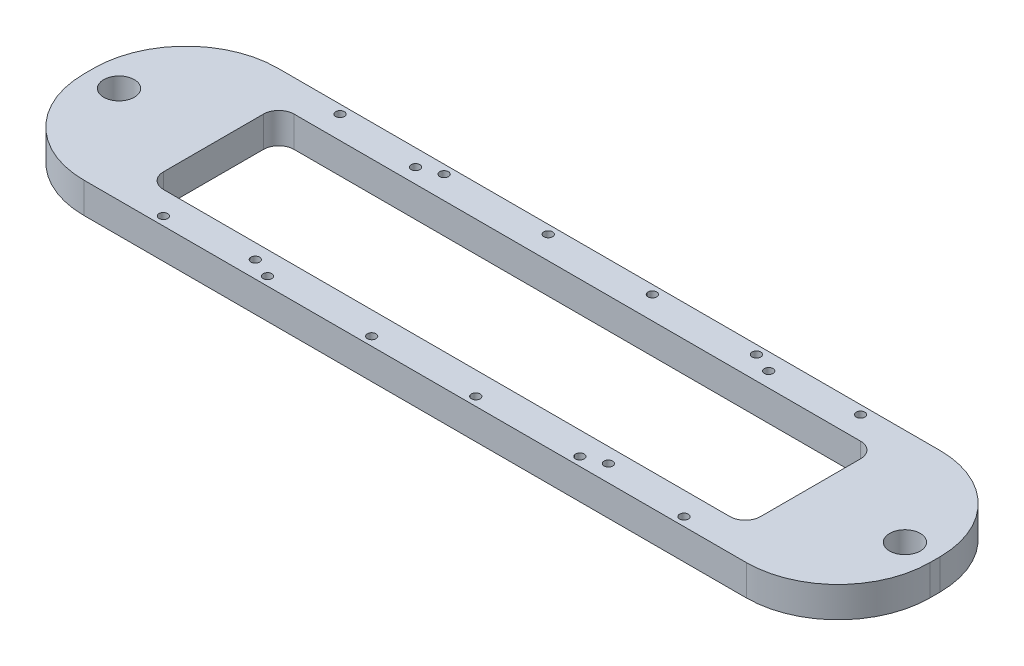
ISO-10303-21;
HEADER;
FILE_DESCRIPTION(('STEP AP214'),'2;1');
FILE_NAME('part.step','',(''),(''),'','','');
FILE_SCHEMA(('AUTOMOTIVE_DESIGN { 1 0 10303 214 1 1 1 1 }'));
ENDSEC;
DATA;
#1=APPLICATION_CONTEXT('core data for automotive mechanical design processes');
#2=APPLICATION_PROTOCOL_DEFINITION('international standard','automotive_design',2000,#1);
#3=PRODUCT_CONTEXT('',#1,'mechanical');
#4=PRODUCT('Part','Part','',(#3));
#5=PRODUCT_RELATED_PRODUCT_CATEGORY('part','',(#4));
#6=PRODUCT_DEFINITION_FORMATION('','',#4);
#7=PRODUCT_DEFINITION_CONTEXT('part definition',#1,'design');
#8=PRODUCT_DEFINITION('design','',#6,#7);
#9=PRODUCT_DEFINITION_SHAPE('','',#8);
#10=(LENGTH_UNIT() NAMED_UNIT(*) SI_UNIT(.MILLI.,.METRE.));
#11=(NAMED_UNIT(*) PLANE_ANGLE_UNIT() SI_UNIT($,.RADIAN.));
#12=(NAMED_UNIT(*) SI_UNIT($,.STERADIAN.) SOLID_ANGLE_UNIT());
#13=UNCERTAINTY_MEASURE_WITH_UNIT(LENGTH_MEASURE(1.E-05),#10,'distance_accuracy_value','');
#14=(GEOMETRIC_REPRESENTATION_CONTEXT(3) GLOBAL_UNCERTAINTY_ASSIGNED_CONTEXT((#13)) GLOBAL_UNIT_ASSIGNED_CONTEXT((#10,
#11,#12)) REPRESENTATION_CONTEXT('',''));
#15=CARTESIAN_POINT('',(0.,0.,0.));
#16=DIRECTION('',(0.,0.,1.));
#17=DIRECTION('',(1.,0.,0.));
#18=AXIS2_PLACEMENT_3D('',#15,#16,#17);
#19=CARTESIAN_POINT('',(57.95,3.,0.499999999999995));
#20=DIRECTION('',(0.,1.,0.));
#21=DIRECTION('',(0.,0.,1.));
#22=AXIS2_PLACEMENT_3D('',#19,#20,#21);
#23=PLANE('',#22);
#24=CARTESIAN_POINT('',(42.8,3.,7.85));
#25=DIRECTION('',(0.,1.,0.));
#26=DIRECTION('',(0.,0.,1.));
#27=AXIS2_PLACEMENT_3D('',#24,#25,#26);
#28=CIRCLE('',#27,0.425000000000003);
#29=CARTESIAN_POINT('',(42.8,3.,8.275));
#30=VERTEX_POINT('',#29);
#31=EDGE_CURVE('E464',#30,#30,#28,.T.);
#32=ORIENTED_EDGE('',*,*,#31,.F.);
#33=EDGE_LOOP('',(#32));
#34=FACE_BOUND('',#33,.T.);
#35=CARTESIAN_POINT('',(8.2,3.,-7.85));
#36=DIRECTION('',(0.,1.,0.));
#37=DIRECTION('',(0.,0.,1.));
#38=AXIS2_PLACEMENT_3D('',#35,#36,#37);
#39=CIRCLE('',#38,0.425);
#40=CARTESIAN_POINT('',(8.2,3.,-7.425));
#41=VERTEX_POINT('',#40);
#42=EDGE_CURVE('E476',#41,#41,#39,.T.);
#43=ORIENTED_EDGE('',*,*,#42,.F.);
#44=EDGE_LOOP('',(#43));
#45=FACE_BOUND('',#44,.T.);
#46=CARTESIAN_POINT('',(40.8,3.,8.65));
#47=DIRECTION('',(0.,1.,0.));
#48=DIRECTION('',(0.,0.,1.));
#49=AXIS2_PLACEMENT_3D('',#46,#47,#48);
#50=CIRCLE('',#49,0.425000000000003);
#51=CARTESIAN_POINT('',(40.8,3.,9.075));
#52=VERTEX_POINT('',#51);
#53=EDGE_CURVE('E488',#52,#52,#50,.T.);
#54=ORIENTED_EDGE('',*,*,#53,.F.);
#55=EDGE_LOOP('',(#54));
#56=FACE_BOUND('',#55,.T.);
#57=CARTESIAN_POINT('',(20.4,3.,8.65));
#58=DIRECTION('',(0.,1.,0.));
#59=DIRECTION('',(0.,0.,1.));
#60=AXIS2_PLACEMENT_3D('',#57,#58,#59);
#61=CIRCLE('',#60,0.425);
#62=CARTESIAN_POINT('',(20.4,3.,9.075));
#63=VERTEX_POINT('',#62);
#64=EDGE_CURVE('E500',#63,#63,#61,.T.);
#65=ORIENTED_EDGE('',*,*,#64,.F.);
#66=EDGE_LOOP('',(#65));
#67=FACE_BOUND('',#66,.T.);
#68=CARTESIAN_POINT('',(0.,3.,8.65));
#69=DIRECTION('',(0.,1.,0.));
#70=DIRECTION('',(0.,0.,1.));
#71=AXIS2_PLACEMENT_3D('',#68,#69,#70);
#72=CIRCLE('',#71,0.424999999999999);
#73=CARTESIAN_POINT('',(0.,3.,9.075));
#74=VERTEX_POINT('',#73);
#75=EDGE_CURVE('E512',#74,#74,#72,.T.);
#76=ORIENTED_EDGE('',*,*,#75,.F.);
#77=EDGE_LOOP('',(#76));
#78=FACE_BOUND('',#77,.T.);
#79=CARTESIAN_POINT('',(10.2,3.,-8.65));
#80=DIRECTION('',(0.,1.,0.));
#81=DIRECTION('',(0.,0.,1.));
#82=AXIS2_PLACEMENT_3D('',#79,#80,#81);
#83=CIRCLE('',#82,0.425);
#84=CARTESIAN_POINT('',(10.2,3.,-8.225));
#85=VERTEX_POINT('',#84);
#86=EDGE_CURVE('E524',#85,#85,#83,.T.);
#87=ORIENTED_EDGE('',*,*,#86,.F.);
#88=EDGE_LOOP('',(#87));
#89=FACE_BOUND('',#88,.T.);
#90=CARTESIAN_POINT('',(30.6,3.,-8.65));
#91=DIRECTION('',(0.,1.,0.));
#92=DIRECTION('',(0.,0.,1.));
#93=AXIS2_PLACEMENT_3D('',#90,#91,#92);
#94=CIRCLE('',#93,0.425);
#95=CARTESIAN_POINT('',(30.6,3.,-8.225));
#96=VERTEX_POINT('',#95);
#97=EDGE_CURVE('E536',#96,#96,#94,.T.);
#98=ORIENTED_EDGE('',*,*,#97,.F.);
#99=EDGE_LOOP('',(#98));
#100=FACE_BOUND('',#99,.T.);
#101=CARTESIAN_POINT('',(51.,3.,-8.65));
#102=DIRECTION('',(0.,1.,0.));
#103=DIRECTION('',(0.,0.,1.));
#104=AXIS2_PLACEMENT_3D('',#101,#102,#103);
#105=CIRCLE('',#104,0.425000000000003);
#106=CARTESIAN_POINT('',(51.,3.,-8.225));
#107=VERTEX_POINT('',#106);
#108=EDGE_CURVE('E184',#107,#107,#105,.T.);
#109=ORIENTED_EDGE('',*,*,#108,.F.);
#110=EDGE_LOOP('',(#109));
#111=FACE_BOUND('',#110,.T.);
#112=CARTESIAN_POINT('',(64.,3.,0.));
#113=DIRECTION('',(0.,1.,0.));
#114=DIRECTION('',(0.,0.,1.));
#115=AXIS2_PLACEMENT_3D('',#112,#113,#114);
#116=CIRCLE('',#115,1.5);
#117=CARTESIAN_POINT('',(64.,3.,1.5));
#118=VERTEX_POINT('',#117);
#119=EDGE_CURVE('E220',#118,#118,#116,.T.);
#120=ORIENTED_EDGE('',*,*,#119,.F.);
#121=EDGE_LOOP('',(#120));
#122=FACE_BOUND('',#121,.T.);
#123=CARTESIAN_POINT('',(57.95,3.,0.499999999999995));
#124=DIRECTION('',(0.,1.,0.));
#125=DIRECTION('',(0.,0.,1.));
#126=AXIS2_PLACEMENT_3D('',#123,#124,#125);
#127=CIRCLE('',#126,9.);
#128=CARTESIAN_POINT('',(57.9499999999999,3.,9.5));
#129=VERTEX_POINT('',#128);
#130=CARTESIAN_POINT('',(66.95,3.,0.499999999999934));
#131=VERTEX_POINT('',#130);
#132=EDGE_CURVE('E226',#129,#131,#127,.T.);
#133=ORIENTED_EDGE('',*,*,#132,.T.);
#134=DIRECTION('',(0.,0.,-1.));
#135=VECTOR('',#134,1.);
#136=CARTESIAN_POINT('',(66.95,3.,-0.499999999999941));
#137=LINE('',#136,#135);
#138=CARTESIAN_POINT('',(66.95,3.,-0.499999999999941));
#139=VERTEX_POINT('',#138);
#140=EDGE_CURVE('E229',#131,#139,#137,.T.);
#141=ORIENTED_EDGE('',*,*,#140,.T.);
#142=CARTESIAN_POINT('',(57.95,3.,-0.500000000000004));
#143=DIRECTION('',(0.,1.,0.));
#144=DIRECTION('',(0.,0.,1.));
#145=AXIS2_PLACEMENT_3D('',#142,#143,#144);
#146=CIRCLE('',#145,9.);
#147=CARTESIAN_POINT('',(57.9499999999999,3.,-9.5));
#148=VERTEX_POINT('',#147);
#149=EDGE_CURVE('E232',#139,#148,#146,.T.);
#150=ORIENTED_EDGE('',*,*,#149,.T.);
#151=DIRECTION('',(-1.,0.,0.));
#152=VECTOR('',#151,1.);
#153=CARTESIAN_POINT('',(57.9499999999999,3.,-9.5));
#154=LINE('',#153,#152);
#155=CARTESIAN_POINT('',(-6.94999999999994,3.,-9.5));
#156=VERTEX_POINT('',#155);
#157=EDGE_CURVE('E234',#148,#156,#154,.T.);
#158=ORIENTED_EDGE('',*,*,#157,.T.);
#159=CARTESIAN_POINT('',(-6.95,3.,-0.499999999999999));
#160=DIRECTION('',(0.,1.,0.));
#161=DIRECTION('',(0.,0.,1.));
#162=AXIS2_PLACEMENT_3D('',#159,#160,#161);
#163=CIRCLE('',#162,9.);
#164=CARTESIAN_POINT('',(-15.95,3.,-0.499999999999932));
#165=VERTEX_POINT('',#164);
#166=EDGE_CURVE('E236',#156,#165,#163,.T.);
#167=ORIENTED_EDGE('',*,*,#166,.T.);
#168=DIRECTION('',(0.,0.,1.));
#169=VECTOR('',#168,1.);
#170=CARTESIAN_POINT('',(-15.95,3.,-0.499999999999932));
#171=LINE('',#170,#169);
#172=CARTESIAN_POINT('',(-15.95,3.,0.500000000000001));
#173=VERTEX_POINT('',#172);
#174=EDGE_CURVE('E238',#165,#173,#171,.T.);
#175=ORIENTED_EDGE('',*,*,#174,.T.);
#176=CARTESIAN_POINT('',(-6.95,3.,0.500000000000002));
#177=DIRECTION('',(0.,1.,0.));
#178=DIRECTION('',(0.,0.,1.));
#179=AXIS2_PLACEMENT_3D('',#176,#177,#178);
#180=CIRCLE('',#179,9.);
#181=CARTESIAN_POINT('',(-6.94999999999994,3.,9.5));
#182=VERTEX_POINT('',#181);
#183=EDGE_CURVE('E240',#173,#182,#180,.T.);
#184=ORIENTED_EDGE('',*,*,#183,.T.);
#185=DIRECTION('',(1.,0.,0.));
#186=VECTOR('',#185,1.);
#187=CARTESIAN_POINT('',(57.9499999999999,3.,9.5));
#188=LINE('',#187,#186);
#189=EDGE_CURVE('E242',#182,#129,#188,.T.);
#190=ORIENTED_EDGE('',*,*,#189,.T.);
#191=EDGE_LOOP('',(#133,#141,#150,#158,#167,#175,#184,#190));
#192=FACE_BOUND('',#191,.T.);
#193=CARTESIAN_POINT('',(-13.,3.,0.));
#194=DIRECTION('',(0.,1.,0.));
#195=DIRECTION('',(0.,0.,1.));
#196=AXIS2_PLACEMENT_3D('',#193,#194,#195);
#197=CIRCLE('',#196,1.5);
#198=CARTESIAN_POINT('',(-13.,3.,1.5));
#199=VERTEX_POINT('',#198);
#200=EDGE_CURVE('E214',#199,#199,#197,.T.);
#201=ORIENTED_EDGE('',*,*,#200,.F.);
#202=EDGE_LOOP('',(#201));
#203=FACE_BOUND('',#202,.T.);
#204=DIRECTION('',(-1.,0.,0.));
#205=VECTOR('',#204,1.);
#206=CARTESIAN_POINT('',(-2.24999999999999,3.,-6.4));
#207=LINE('',#206,#205);
#208=CARTESIAN_POINT('',(53.25,3.,-6.4));
#209=VERTEX_POINT('',#208);
#210=CARTESIAN_POINT('',(-2.24999999999999,3.,-6.4));
#211=VERTEX_POINT('',#210);
#212=EDGE_CURVE('E154',#209,#211,#207,.T.);
#213=ORIENTED_EDGE('',*,*,#212,.F.);
#214=CARTESIAN_POINT('',(53.25,3.,-4.9));
#215=DIRECTION('',(0.,1.,0.));
#216=DIRECTION('',(0.,0.,1.));
#217=AXIS2_PLACEMENT_3D('',#214,#215,#216);
#218=CIRCLE('',#217,1.5);
#219=CARTESIAN_POINT('',(54.75,3.,-4.89999999999999));
#220=VERTEX_POINT('',#219);
#221=EDGE_CURVE('E146',#220,#209,#218,.T.);
#222=ORIENTED_EDGE('',*,*,#221,.F.);
#223=DIRECTION('',(0.,0.,-1.));
#224=VECTOR('',#223,1.);
#225=CARTESIAN_POINT('',(54.75,3.,-4.89999999999999));
#226=LINE('',#225,#224);
#227=CARTESIAN_POINT('',(54.75,3.,4.9));
#228=VERTEX_POINT('',#227);
#229=EDGE_CURVE('E181',#228,#220,#226,.T.);
#230=ORIENTED_EDGE('',*,*,#229,.F.);
#231=CARTESIAN_POINT('',(53.25,3.,4.9));
#232=DIRECTION('',(0.,1.,0.));
#233=DIRECTION('',(0.,0.,1.));
#234=AXIS2_PLACEMENT_3D('',#231,#232,#233);
#235=CIRCLE('',#234,1.5);
#236=CARTESIAN_POINT('',(53.25,3.,6.4));
#237=VERTEX_POINT('',#236);
#238=EDGE_CURVE('E179',#237,#228,#235,.T.);
#239=ORIENTED_EDGE('',*,*,#238,.F.);
#240=DIRECTION('',(1.,0.,0.));
#241=VECTOR('',#240,1.);
#242=CARTESIAN_POINT('',(-2.24999999999999,3.,6.4));
#243=LINE('',#242,#241);
#244=CARTESIAN_POINT('',(-2.24999999999999,3.,6.4));
#245=VERTEX_POINT('',#244);
#246=EDGE_CURVE('E177',#245,#237,#243,.T.);
#247=ORIENTED_EDGE('',*,*,#246,.F.);
#248=CARTESIAN_POINT('',(-2.25,3.,4.9));
#249=DIRECTION('',(0.,1.,0.));
#250=DIRECTION('',(0.,0.,1.));
#251=AXIS2_PLACEMENT_3D('',#248,#249,#250);
#252=CIRCLE('',#251,1.5);
#253=CARTESIAN_POINT('',(-3.75,3.,4.89999999999999));
#254=VERTEX_POINT('',#253);
#255=EDGE_CURVE('E175',#254,#245,#252,.T.);
#256=ORIENTED_EDGE('',*,*,#255,.F.);
#257=DIRECTION('',(0.,0.,1.));
#258=VECTOR('',#257,1.);
#259=CARTESIAN_POINT('',(-3.75,3.,-4.89999999999999));
#260=LINE('',#259,#258);
#261=CARTESIAN_POINT('',(-3.75,3.,-4.89999999999999));
#262=VERTEX_POINT('',#261);
#263=EDGE_CURVE('E170',#262,#254,#260,.T.);
#264=ORIENTED_EDGE('',*,*,#263,.F.);
#265=CARTESIAN_POINT('',(-2.25,3.,-4.9));
#266=DIRECTION('',(0.,1.,0.));
#267=DIRECTION('',(0.,0.,1.));
#268=AXIS2_PLACEMENT_3D('',#265,#266,#267);
#269=CIRCLE('',#268,1.5);
#270=EDGE_CURVE('E168',#211,#262,#269,.T.);
#271=ORIENTED_EDGE('',*,*,#270,.F.);
#272=EDGE_LOOP('',(#213,#222,#230,#239,#247,#256,#264,#271));
#273=FACE_BOUND('',#272,.T.);
#274=CARTESIAN_POINT('',(40.8,3.,-8.65));
#275=DIRECTION('',(0.,1.,0.));
#276=DIRECTION('',(0.,0.,1.));
#277=AXIS2_PLACEMENT_3D('',#274,#275,#276);
#278=CIRCLE('',#277,0.425000000000003);
#279=CARTESIAN_POINT('',(40.8,3.,-8.225));
#280=VERTEX_POINT('',#279);
#281=EDGE_CURVE('E542',#280,#280,#278,.T.);
#282=ORIENTED_EDGE('',*,*,#281,.F.);
#283=EDGE_LOOP('',(#282));
#284=FACE_BOUND('',#283,.T.);
#285=CARTESIAN_POINT('',(20.4,3.,-8.65));
#286=DIRECTION('',(0.,1.,0.));
#287=DIRECTION('',(0.,0.,1.));
#288=AXIS2_PLACEMENT_3D('',#285,#286,#287);
#289=CIRCLE('',#288,0.425);
#290=CARTESIAN_POINT('',(20.4,3.,-8.225));
#291=VERTEX_POINT('',#290);
#292=EDGE_CURVE('E530',#291,#291,#289,.T.);
#293=ORIENTED_EDGE('',*,*,#292,.F.);
#294=EDGE_LOOP('',(#293));
#295=FACE_BOUND('',#294,.T.);
#296=CARTESIAN_POINT('',(0.,3.,-8.65));
#297=DIRECTION('',(0.,1.,0.));
#298=DIRECTION('',(0.,0.,1.));
#299=AXIS2_PLACEMENT_3D('',#296,#297,#298);
#300=CIRCLE('',#299,0.425);
#301=CARTESIAN_POINT('',(0.,3.,-8.225));
#302=VERTEX_POINT('',#301);
#303=EDGE_CURVE('E518',#302,#302,#300,.T.);
#304=ORIENTED_EDGE('',*,*,#303,.F.);
#305=EDGE_LOOP('',(#304));
#306=FACE_BOUND('',#305,.T.);
#307=CARTESIAN_POINT('',(10.2,3.,8.65));
#308=DIRECTION('',(0.,1.,0.));
#309=DIRECTION('',(0.,0.,1.));
#310=AXIS2_PLACEMENT_3D('',#307,#308,#309);
#311=CIRCLE('',#310,0.424999999999998);
#312=CARTESIAN_POINT('',(10.2,3.,9.075));
#313=VERTEX_POINT('',#312);
#314=EDGE_CURVE('E506',#313,#313,#311,.T.);
#315=ORIENTED_EDGE('',*,*,#314,.F.);
#316=EDGE_LOOP('',(#315));
#317=FACE_BOUND('',#316,.T.);
#318=CARTESIAN_POINT('',(30.6,3.,8.65));
#319=DIRECTION('',(0.,1.,0.));
#320=DIRECTION('',(0.,0.,1.));
#321=AXIS2_PLACEMENT_3D('',#318,#319,#320);
#322=CIRCLE('',#321,0.425);
#323=CARTESIAN_POINT('',(30.6,3.,9.075));
#324=VERTEX_POINT('',#323);
#325=EDGE_CURVE('E494',#324,#324,#322,.T.);
#326=ORIENTED_EDGE('',*,*,#325,.F.);
#327=EDGE_LOOP('',(#326));
#328=FACE_BOUND('',#327,.T.);
#329=CARTESIAN_POINT('',(51.,3.,8.65));
#330=DIRECTION('',(0.,1.,0.));
#331=DIRECTION('',(0.,0.,1.));
#332=AXIS2_PLACEMENT_3D('',#329,#330,#331);
#333=CIRCLE('',#332,0.425000000000003);
#334=CARTESIAN_POINT('',(51.,3.,9.075));
#335=VERTEX_POINT('',#334);
#336=EDGE_CURVE('E482',#335,#335,#333,.T.);
#337=ORIENTED_EDGE('',*,*,#336,.F.);
#338=EDGE_LOOP('',(#337));
#339=FACE_BOUND('',#338,.T.);
#340=CARTESIAN_POINT('',(42.8,3.,-7.85));
#341=DIRECTION('',(0.,1.,0.));
#342=DIRECTION('',(0.,0.,1.));
#343=AXIS2_PLACEMENT_3D('',#340,#341,#342);
#344=CIRCLE('',#343,0.425000000000003);
#345=CARTESIAN_POINT('',(42.8,3.,-7.425));
#346=VERTEX_POINT('',#345);
#347=EDGE_CURVE('E470',#346,#346,#344,.T.);
#348=ORIENTED_EDGE('',*,*,#347,.F.);
#349=EDGE_LOOP('',(#348));
#350=FACE_BOUND('',#349,.T.);
#351=CARTESIAN_POINT('',(8.20000000000001,3.,7.85));
#352=DIRECTION('',(0.,1.,0.));
#353=DIRECTION('',(0.,0.,1.));
#354=AXIS2_PLACEMENT_3D('',#351,#352,#353);
#355=CIRCLE('',#354,0.425);
#356=CARTESIAN_POINT('',(8.20000000000001,3.,8.275));
#357=VERTEX_POINT('',#356);
#358=EDGE_CURVE('E455',#357,#357,#355,.T.);
#359=ORIENTED_EDGE('',*,*,#358,.F.);
#360=EDGE_LOOP('',(#359));
#361=FACE_BOUND('',#360,.T.);
#362=ADVANCED_FACE('F33',(#34,#45,#56,#67,#78,#89,#100,#111,#122,#192,#203,#273,#284,#295,#306,
#317,#328,#339,#350,#361),#23,.T.);
#363=CARTESIAN_POINT('',(57.95,0.,0.499999999999995));
#364=DIRECTION('',(0.,1.,0.));
#365=DIRECTION('',(0.,0.,1.));
#366=AXIS2_PLACEMENT_3D('',#363,#364,#365);
#367=PLANE('',#366);
#368=CARTESIAN_POINT('',(-13.,0.,0.));
#369=DIRECTION('',(0.,1.,0.));
#370=DIRECTION('',(0.,0.,1.));
#371=AXIS2_PLACEMENT_3D('',#368,#369,#370);
#372=CIRCLE('',#371,1.5);
#373=CARTESIAN_POINT('',(-13.,0.,1.5));
#374=VERTEX_POINT('',#373);
#375=EDGE_CURVE('E162',#374,#374,#372,.T.);
#376=ORIENTED_EDGE('',*,*,#375,.T.);
#377=EDGE_LOOP('',(#376));
#378=FACE_BOUND('',#377,.T.);
#379=CARTESIAN_POINT('',(64.,0.,0.));
#380=DIRECTION('',(0.,1.,0.));
#381=DIRECTION('',(0.,0.,1.));
#382=AXIS2_PLACEMENT_3D('',#379,#380,#381);
#383=CIRCLE('',#382,1.5);
#384=CARTESIAN_POINT('',(64.,0.,1.5));
#385=VERTEX_POINT('',#384);
#386=EDGE_CURVE('E217',#385,#385,#383,.T.);
#387=ORIENTED_EDGE('',*,*,#386,.T.);
#388=EDGE_LOOP('',(#387));
#389=FACE_BOUND('',#388,.T.);
#390=CARTESIAN_POINT('',(57.95,0.,0.499999999999995));
#391=DIRECTION('',(0.,1.,0.));
#392=DIRECTION('',(0.,0.,1.));
#393=AXIS2_PLACEMENT_3D('',#390,#391,#392);
#394=CIRCLE('',#393,9.);
#395=CARTESIAN_POINT('',(57.9499999999999,0.,9.5));
#396=VERTEX_POINT('',#395);
#397=CARTESIAN_POINT('',(66.95,0.,0.499999999999934));
#398=VERTEX_POINT('',#397);
#399=EDGE_CURVE('E223',#396,#398,#394,.T.);
#400=ORIENTED_EDGE('',*,*,#399,.F.);
#401=DIRECTION('',(1.,0.,0.));
#402=VECTOR('',#401,1.);
#403=CARTESIAN_POINT('',(57.9499999999999,0.,9.5));
#404=LINE('',#403,#402);
#405=CARTESIAN_POINT('',(-6.94999999999994,0.,9.5));
#406=VERTEX_POINT('',#405);
#407=EDGE_CURVE('E230',#406,#396,#404,.T.);
#408=ORIENTED_EDGE('',*,*,#407,.F.);
#409=CARTESIAN_POINT('',(-6.95,0.,0.500000000000002));
#410=DIRECTION('',(0.,1.,0.));
#411=DIRECTION('',(0.,0.,1.));
#412=AXIS2_PLACEMENT_3D('',#409,#410,#411);
#413=CIRCLE('',#412,9.);
#414=CARTESIAN_POINT('',(-15.95,0.,0.500000000000001));
#415=VERTEX_POINT('',#414);
#416=EDGE_CURVE('E257',#415,#406,#413,.T.);
#417=ORIENTED_EDGE('',*,*,#416,.F.);
#418=DIRECTION('',(0.,0.,1.));
#419=VECTOR('',#418,1.);
#420=CARTESIAN_POINT('',(-15.95,0.,-0.499999999999932));
#421=LINE('',#420,#419);
#422=CARTESIAN_POINT('',(-15.95,0.,-0.499999999999932));
#423=VERTEX_POINT('',#422);
#424=EDGE_CURVE('E255',#423,#415,#421,.T.);
#425=ORIENTED_EDGE('',*,*,#424,.F.);
#426=CARTESIAN_POINT('',(-6.95,0.,-0.499999999999999));
#427=DIRECTION('',(0.,1.,0.));
#428=DIRECTION('',(0.,0.,1.));
#429=AXIS2_PLACEMENT_3D('',#426,#427,#428);
#430=CIRCLE('',#429,9.);
#431=CARTESIAN_POINT('',(-6.94999999999994,0.,-9.5));
#432=VERTEX_POINT('',#431);
#433=EDGE_CURVE('E253',#432,#423,#430,.T.);
#434=ORIENTED_EDGE('',*,*,#433,.F.);
#435=DIRECTION('',(-1.,0.,0.));
#436=VECTOR('',#435,1.);
#437=CARTESIAN_POINT('',(57.9499999999999,0.,-9.5));
#438=LINE('',#437,#436);
#439=CARTESIAN_POINT('',(57.9499999999999,0.,-9.5));
#440=VERTEX_POINT('',#439);
#441=EDGE_CURVE('E251',#440,#432,#438,.T.);
#442=ORIENTED_EDGE('',*,*,#441,.F.);
#443=CARTESIAN_POINT('',(57.95,0.,-0.500000000000004));
#444=DIRECTION('',(0.,1.,0.));
#445=DIRECTION('',(0.,0.,1.));
#446=AXIS2_PLACEMENT_3D('',#443,#444,#445);
#447=CIRCLE('',#446,9.);
#448=CARTESIAN_POINT('',(66.95,0.,-0.499999999999941));
#449=VERTEX_POINT('',#448);
#450=EDGE_CURVE('E249',#449,#440,#447,.T.);
#451=ORIENTED_EDGE('',*,*,#450,.F.);
#452=DIRECTION('',(0.,0.,-1.));
#453=VECTOR('',#452,1.);
#454=CARTESIAN_POINT('',(66.95,0.,-0.499999999999941));
#455=LINE('',#454,#453);
#456=EDGE_CURVE('E247',#398,#449,#455,.T.);
#457=ORIENTED_EDGE('',*,*,#456,.F.);
#458=EDGE_LOOP('',(#400,#408,#417,#425,#434,#442,#451,#457));
#459=FACE_BOUND('',#458,.T.);
#460=CARTESIAN_POINT('',(53.25,0.,-4.9));
#461=DIRECTION('',(0.,1.,0.));
#462=DIRECTION('',(0.,0.,1.));
#463=AXIS2_PLACEMENT_3D('',#460,#461,#462);
#464=CIRCLE('',#463,1.5);
#465=CARTESIAN_POINT('',(54.75,0.,-4.89999999999999));
#466=VERTEX_POINT('',#465);
#467=CARTESIAN_POINT('',(53.25,0.,-6.4));
#468=VERTEX_POINT('',#467);
#469=EDGE_CURVE('E56',#466,#468,#464,.T.);
#470=ORIENTED_EDGE('',*,*,#469,.T.);
#471=DIRECTION('',(-1.,0.,0.));
#472=VECTOR('',#471,1.);
#473=CARTESIAN_POINT('',(-2.24999999999999,0.,-6.4));
#474=LINE('',#473,#472);
#475=CARTESIAN_POINT('',(-2.24999999999999,0.,-6.4));
#476=VERTEX_POINT('',#475);
#477=EDGE_CURVE('E161',#468,#476,#474,.T.);
#478=ORIENTED_EDGE('',*,*,#477,.T.);
#479=CARTESIAN_POINT('',(-2.25,0.,-4.9));
#480=DIRECTION('',(0.,1.,0.));
#481=DIRECTION('',(0.,0.,1.));
#482=AXIS2_PLACEMENT_3D('',#479,#480,#481);
#483=CIRCLE('',#482,1.5);
#484=CARTESIAN_POINT('',(-3.75,0.,-4.89999999999999));
#485=VERTEX_POINT('',#484);
#486=EDGE_CURVE('E186',#476,#485,#483,.T.);
#487=ORIENTED_EDGE('',*,*,#486,.T.);
#488=DIRECTION('',(0.,0.,1.));
#489=VECTOR('',#488,1.);
#490=CARTESIAN_POINT('',(-3.75,0.,-4.89999999999999));
#491=LINE('',#490,#489);
#492=CARTESIAN_POINT('',(-3.75,0.,4.89999999999999));
#493=VERTEX_POINT('',#492);
#494=EDGE_CURVE('E189',#485,#493,#491,.T.);
#495=ORIENTED_EDGE('',*,*,#494,.T.);
#496=CARTESIAN_POINT('',(-2.25,0.,4.9));
#497=DIRECTION('',(0.,1.,0.));
#498=DIRECTION('',(0.,0.,1.));
#499=AXIS2_PLACEMENT_3D('',#496,#497,#498);
#500=CIRCLE('',#499,1.5);
#501=CARTESIAN_POINT('',(-2.24999999999999,0.,6.4));
#502=VERTEX_POINT('',#501);
#503=EDGE_CURVE('E192',#493,#502,#500,.T.);
#504=ORIENTED_EDGE('',*,*,#503,.T.);
#505=DIRECTION('',(1.,0.,0.));
#506=VECTOR('',#505,1.);
#507=CARTESIAN_POINT('',(-2.24999999999999,0.,6.4));
#508=LINE('',#507,#506);
#509=CARTESIAN_POINT('',(53.25,0.,6.4));
#510=VERTEX_POINT('',#509);
#511=EDGE_CURVE('E195',#502,#510,#508,.T.);
#512=ORIENTED_EDGE('',*,*,#511,.T.);
#513=CARTESIAN_POINT('',(53.25,0.,4.9));
#514=DIRECTION('',(0.,1.,0.));
#515=DIRECTION('',(0.,0.,1.));
#516=AXIS2_PLACEMENT_3D('',#513,#514,#515);
#517=CIRCLE('',#516,1.5);
#518=CARTESIAN_POINT('',(54.75,0.,4.9));
#519=VERTEX_POINT('',#518);
#520=EDGE_CURVE('E198',#510,#519,#517,.T.);
#521=ORIENTED_EDGE('',*,*,#520,.T.);
#522=DIRECTION('',(0.,0.,-1.));
#523=VECTOR('',#522,1.);
#524=CARTESIAN_POINT('',(54.75,0.,-4.89999999999999));
#525=LINE('',#524,#523);
#526=EDGE_CURVE('E155',#519,#466,#525,.T.);
#527=ORIENTED_EDGE('',*,*,#526,.T.);
#528=EDGE_LOOP('',(#470,#478,#487,#495,#504,#512,#521,#527));
#529=FACE_BOUND('',#528,.T.);
#530=CARTESIAN_POINT('',(51.,0.,-8.65));
#531=DIRECTION('',(0.,1.,0.));
#532=DIRECTION('',(0.,0.,1.));
#533=AXIS2_PLACEMENT_3D('',#530,#531,#532);
#534=CIRCLE('',#533,0.425000000000003);
#535=CARTESIAN_POINT('',(51.,0.,-8.225));
#536=VERTEX_POINT('',#535);
#537=EDGE_CURVE('E545',#536,#536,#534,.T.);
#538=ORIENTED_EDGE('',*,*,#537,.T.);
#539=EDGE_LOOP('',(#538));
#540=FACE_BOUND('',#539,.T.);
#541=CARTESIAN_POINT('',(40.8,0.,-8.65));
#542=DIRECTION('',(0.,1.,0.));
#543=DIRECTION('',(0.,0.,1.));
#544=AXIS2_PLACEMENT_3D('',#541,#542,#543);
#545=CIRCLE('',#544,0.425000000000003);
#546=CARTESIAN_POINT('',(40.8,0.,-8.225));
#547=VERTEX_POINT('',#546);
#548=EDGE_CURVE('E539',#547,#547,#545,.T.);
#549=ORIENTED_EDGE('',*,*,#548,.T.);
#550=EDGE_LOOP('',(#549));
#551=FACE_BOUND('',#550,.T.);
#552=CARTESIAN_POINT('',(30.6,0.,-8.65));
#553=DIRECTION('',(0.,1.,0.));
#554=DIRECTION('',(0.,0.,1.));
#555=AXIS2_PLACEMENT_3D('',#552,#553,#554);
#556=CIRCLE('',#555,0.425);
#557=CARTESIAN_POINT('',(30.6,0.,-8.225));
#558=VERTEX_POINT('',#557);
#559=EDGE_CURVE('E533',#558,#558,#556,.T.);
#560=ORIENTED_EDGE('',*,*,#559,.T.);
#561=EDGE_LOOP('',(#560));
#562=FACE_BOUND('',#561,.T.);
#563=CARTESIAN_POINT('',(20.4,0.,-8.65));
#564=DIRECTION('',(0.,1.,0.));
#565=DIRECTION('',(0.,0.,1.));
#566=AXIS2_PLACEMENT_3D('',#563,#564,#565);
#567=CIRCLE('',#566,0.425);
#568=CARTESIAN_POINT('',(20.4,0.,-8.225));
#569=VERTEX_POINT('',#568);
#570=EDGE_CURVE('E527',#569,#569,#567,.T.);
#571=ORIENTED_EDGE('',*,*,#570,.T.);
#572=EDGE_LOOP('',(#571));
#573=FACE_BOUND('',#572,.T.);
#574=CARTESIAN_POINT('',(10.2,0.,-8.65));
#575=DIRECTION('',(0.,1.,0.));
#576=DIRECTION('',(0.,0.,1.));
#577=AXIS2_PLACEMENT_3D('',#574,#575,#576);
#578=CIRCLE('',#577,0.425);
#579=CARTESIAN_POINT('',(10.2,0.,-8.225));
#580=VERTEX_POINT('',#579);
#581=EDGE_CURVE('E521',#580,#580,#578,.T.);
#582=ORIENTED_EDGE('',*,*,#581,.T.);
#583=EDGE_LOOP('',(#582));
#584=FACE_BOUND('',#583,.T.);
#585=CARTESIAN_POINT('',(0.,0.,-8.65));
#586=DIRECTION('',(0.,1.,0.));
#587=DIRECTION('',(0.,0.,1.));
#588=AXIS2_PLACEMENT_3D('',#585,#586,#587);
#589=CIRCLE('',#588,0.425);
#590=CARTESIAN_POINT('',(0.,0.,-8.225));
#591=VERTEX_POINT('',#590);
#592=EDGE_CURVE('E515',#591,#591,#589,.T.);
#593=ORIENTED_EDGE('',*,*,#592,.T.);
#594=EDGE_LOOP('',(#593));
#595=FACE_BOUND('',#594,.T.);
#596=CARTESIAN_POINT('',(0.,0.,8.65));
#597=DIRECTION('',(0.,1.,0.));
#598=DIRECTION('',(0.,0.,1.));
#599=AXIS2_PLACEMENT_3D('',#596,#597,#598);
#600=CIRCLE('',#599,0.424999999999999);
#601=CARTESIAN_POINT('',(0.,0.,9.075));
#602=VERTEX_POINT('',#601);
#603=EDGE_CURVE('E509',#602,#602,#600,.T.);
#604=ORIENTED_EDGE('',*,*,#603,.T.);
#605=EDGE_LOOP('',(#604));
#606=FACE_BOUND('',#605,.T.);
#607=CARTESIAN_POINT('',(10.2,0.,8.65));
#608=DIRECTION('',(0.,1.,0.));
#609=DIRECTION('',(0.,0.,1.));
#610=AXIS2_PLACEMENT_3D('',#607,#608,#609);
#611=CIRCLE('',#610,0.424999999999998);
#612=CARTESIAN_POINT('',(10.2,0.,9.075));
#613=VERTEX_POINT('',#612);
#614=EDGE_CURVE('E503',#613,#613,#611,.T.);
#615=ORIENTED_EDGE('',*,*,#614,.T.);
#616=EDGE_LOOP('',(#615));
#617=FACE_BOUND('',#616,.T.);
#618=CARTESIAN_POINT('',(20.4,0.,8.65));
#619=DIRECTION('',(0.,1.,0.));
#620=DIRECTION('',(0.,0.,1.));
#621=AXIS2_PLACEMENT_3D('',#618,#619,#620);
#622=CIRCLE('',#621,0.425);
#623=CARTESIAN_POINT('',(20.4,0.,9.075));
#624=VERTEX_POINT('',#623);
#625=EDGE_CURVE('E497',#624,#624,#622,.T.);
#626=ORIENTED_EDGE('',*,*,#625,.T.);
#627=EDGE_LOOP('',(#626));
#628=FACE_BOUND('',#627,.T.);
#629=CARTESIAN_POINT('',(30.6,0.,8.65));
#630=DIRECTION('',(0.,1.,0.));
#631=DIRECTION('',(0.,0.,1.));
#632=AXIS2_PLACEMENT_3D('',#629,#630,#631);
#633=CIRCLE('',#632,0.425);
#634=CARTESIAN_POINT('',(30.6,0.,9.075));
#635=VERTEX_POINT('',#634);
#636=EDGE_CURVE('E491',#635,#635,#633,.T.);
#637=ORIENTED_EDGE('',*,*,#636,.T.);
#638=EDGE_LOOP('',(#637));
#639=FACE_BOUND('',#638,.T.);
#640=CARTESIAN_POINT('',(40.8,0.,8.65));
#641=DIRECTION('',(0.,1.,0.));
#642=DIRECTION('',(0.,0.,1.));
#643=AXIS2_PLACEMENT_3D('',#640,#641,#642);
#644=CIRCLE('',#643,0.425000000000003);
#645=CARTESIAN_POINT('',(40.8,0.,9.075));
#646=VERTEX_POINT('',#645);
#647=EDGE_CURVE('E485',#646,#646,#644,.T.);
#648=ORIENTED_EDGE('',*,*,#647,.T.);
#649=EDGE_LOOP('',(#648));
#650=FACE_BOUND('',#649,.T.);
#651=CARTESIAN_POINT('',(51.,0.,8.65));
#652=DIRECTION('',(0.,1.,0.));
#653=DIRECTION('',(0.,0.,1.));
#654=AXIS2_PLACEMENT_3D('',#651,#652,#653);
#655=CIRCLE('',#654,0.425000000000003);
#656=CARTESIAN_POINT('',(51.,0.,9.075));
#657=VERTEX_POINT('',#656);
#658=EDGE_CURVE('E479',#657,#657,#655,.T.);
#659=ORIENTED_EDGE('',*,*,#658,.T.);
#660=EDGE_LOOP('',(#659));
#661=FACE_BOUND('',#660,.T.);
#662=CARTESIAN_POINT('',(8.2,0.,-7.85));
#663=DIRECTION('',(0.,1.,0.));
#664=DIRECTION('',(0.,0.,1.));
#665=AXIS2_PLACEMENT_3D('',#662,#663,#664);
#666=CIRCLE('',#665,0.425);
#667=CARTESIAN_POINT('',(8.2,0.,-7.425));
#668=VERTEX_POINT('',#667);
#669=EDGE_CURVE('E473',#668,#668,#666,.T.);
#670=ORIENTED_EDGE('',*,*,#669,.T.);
#671=EDGE_LOOP('',(#670));
#672=FACE_BOUND('',#671,.T.);
#673=CARTESIAN_POINT('',(42.8,0.,-7.85));
#674=DIRECTION('',(0.,1.,0.));
#675=DIRECTION('',(0.,0.,1.));
#676=AXIS2_PLACEMENT_3D('',#673,#674,#675);
#677=CIRCLE('',#676,0.425000000000003);
#678=CARTESIAN_POINT('',(42.8,0.,-7.425));
#679=VERTEX_POINT('',#678);
#680=EDGE_CURVE('E467',#679,#679,#677,.T.);
#681=ORIENTED_EDGE('',*,*,#680,.T.);
#682=EDGE_LOOP('',(#681));
#683=FACE_BOUND('',#682,.T.);
#684=CARTESIAN_POINT('',(42.8,0.,7.85));
#685=DIRECTION('',(0.,1.,0.));
#686=DIRECTION('',(0.,0.,1.));
#687=AXIS2_PLACEMENT_3D('',#684,#685,#686);
#688=CIRCLE('',#687,0.425000000000003);
#689=CARTESIAN_POINT('',(42.8,0.,8.275));
#690=VERTEX_POINT('',#689);
#691=EDGE_CURVE('E461',#690,#690,#688,.T.);
#692=ORIENTED_EDGE('',*,*,#691,.T.);
#693=EDGE_LOOP('',(#692));
#694=FACE_BOUND('',#693,.T.);
#695=CARTESIAN_POINT('',(8.20000000000001,0.,7.85));
#696=DIRECTION('',(0.,1.,0.));
#697=DIRECTION('',(0.,0.,1.));
#698=AXIS2_PLACEMENT_3D('',#695,#696,#697);
#699=CIRCLE('',#698,0.425);
#700=CARTESIAN_POINT('',(8.20000000000001,0.,8.275));
#701=VERTEX_POINT('',#700);
#702=EDGE_CURVE('E458',#701,#701,#699,.T.);
#703=ORIENTED_EDGE('',*,*,#702,.T.);
#704=EDGE_LOOP('',(#703));
#705=FACE_BOUND('',#704,.T.);
#706=ADVANCED_FACE('F287',(#378,#389,#459,#529,#540,#551,#562,#573,#584,#595,#606,#617,#628,
#639,#650,#661,#672,#683,#694,#705),#367,.F.);
#707=CARTESIAN_POINT('',(57.95,3.,0.499999999999995));
#708=DIRECTION('',(0.,-1.,0.));
#709=DIRECTION('',(0.,0.,-1.));
#710=AXIS2_PLACEMENT_3D('',#707,#708,#709);
#711=CYLINDRICAL_SURFACE('',#710,9.);
#712=ORIENTED_EDGE('',*,*,#399,.T.);
#713=DIRECTION('',(0.,-1.,0.));
#714=VECTOR('',#713,1.);
#715=CARTESIAN_POINT('',(66.95,3.,0.499999999999934));
#716=LINE('',#715,#714);
#717=EDGE_CURVE('E11',#131,#398,#716,.T.);
#718=ORIENTED_EDGE('',*,*,#717,.F.);
#719=ORIENTED_EDGE('',*,*,#132,.F.);
#720=DIRECTION('',(0.,-1.,0.));
#721=VECTOR('',#720,1.);
#722=CARTESIAN_POINT('',(57.9499999999999,3.,9.5));
#723=LINE('',#722,#721);
#724=EDGE_CURVE('E244',#129,#396,#723,.T.);
#725=ORIENTED_EDGE('',*,*,#724,.T.);
#726=EDGE_LOOP('',(#712,#718,#719,#725));
#727=FACE_BOUND('',#726,.T.);
#728=ADVANCED_FACE('F35',(#727),#711,.T.);
#729=CARTESIAN_POINT('',(66.95,3.,-0.499999999999941));
#730=DIRECTION('',(-1.,0.,0.));
#731=DIRECTION('',(0.,0.,1.));
#732=AXIS2_PLACEMENT_3D('',#729,#730,#731);
#733=PLANE('',#732);
#734=ORIENTED_EDGE('',*,*,#456,.T.);
#735=DIRECTION('',(0.,-1.,0.));
#736=VECTOR('',#735,1.);
#737=CARTESIAN_POINT('',(66.95,3.,-0.499999999999941));
#738=LINE('',#737,#736);
#739=EDGE_CURVE('E41',#139,#449,#738,.T.);
#740=ORIENTED_EDGE('',*,*,#739,.F.);
#741=ORIENTED_EDGE('',*,*,#140,.F.);
#742=ORIENTED_EDGE('',*,*,#717,.T.);
#743=EDGE_LOOP('',(#734,#740,#741,#742));
#744=FACE_BOUND('',#743,.T.);
#745=ADVANCED_FACE('F305',(#744),#733,.F.);
#746=CARTESIAN_POINT('',(57.95,3.,-0.500000000000004));
#747=DIRECTION('',(0.,-1.,0.));
#748=DIRECTION('',(0.,0.,-1.));
#749=AXIS2_PLACEMENT_3D('',#746,#747,#748);
#750=CYLINDRICAL_SURFACE('',#749,9.);
#751=ORIENTED_EDGE('',*,*,#450,.T.);
#752=DIRECTION('',(0.,-1.,0.));
#753=VECTOR('',#752,1.);
#754=CARTESIAN_POINT('',(57.9499999999999,3.,-9.5));
#755=LINE('',#754,#753);
#756=EDGE_CURVE('E274',#148,#440,#755,.T.);
#757=ORIENTED_EDGE('',*,*,#756,.F.);
#758=ORIENTED_EDGE('',*,*,#149,.F.);
#759=ORIENTED_EDGE('',*,*,#739,.T.);
#760=EDGE_LOOP('',(#751,#757,#758,#759));
#761=FACE_BOUND('',#760,.T.);
#762=ADVANCED_FACE('F281',(#761),#750,.T.);
#763=CARTESIAN_POINT('',(57.9499999999999,3.,-9.5));
#764=DIRECTION('',(0.,0.,1.));
#765=DIRECTION('',(1.,0.,0.));
#766=AXIS2_PLACEMENT_3D('',#763,#764,#765);
#767=PLANE('',#766);
#768=ORIENTED_EDGE('',*,*,#441,.T.);
#769=DIRECTION('',(0.,-1.,0.));
#770=VECTOR('',#769,1.);
#771=CARTESIAN_POINT('',(-6.94999999999994,3.,-9.5));
#772=LINE('',#771,#770);
#773=EDGE_CURVE('E271',#156,#432,#772,.T.);
#774=ORIENTED_EDGE('',*,*,#773,.F.);
#775=ORIENTED_EDGE('',*,*,#157,.F.);
#776=ORIENTED_EDGE('',*,*,#756,.T.);
#777=EDGE_LOOP('',(#768,#774,#775,#776));
#778=FACE_BOUND('',#777,.T.);
#779=ADVANCED_FACE('F293',(#778),#767,.F.);
#780=CARTESIAN_POINT('',(-6.95,3.,-0.499999999999999));
#781=DIRECTION('',(0.,-1.,0.));
#782=DIRECTION('',(0.,0.,-1.));
#783=AXIS2_PLACEMENT_3D('',#780,#781,#782);
#784=CYLINDRICAL_SURFACE('',#783,9.);
#785=ORIENTED_EDGE('',*,*,#433,.T.);
#786=DIRECTION('',(0.,-1.,0.));
#787=VECTOR('',#786,1.);
#788=CARTESIAN_POINT('',(-15.95,3.,-0.499999999999932));
#789=LINE('',#788,#787);
#790=EDGE_CURVE('E268',#165,#423,#789,.T.);
#791=ORIENTED_EDGE('',*,*,#790,.F.);
#792=ORIENTED_EDGE('',*,*,#166,.F.);
#793=ORIENTED_EDGE('',*,*,#773,.T.);
#794=EDGE_LOOP('',(#785,#791,#792,#793));
#795=FACE_BOUND('',#794,.T.);
#796=ADVANCED_FACE('F297',(#795),#784,.T.);
#797=CARTESIAN_POINT('',(-15.95,3.,-0.499999999999932));
#798=DIRECTION('',(1.,0.,0.));
#799=DIRECTION('',(0.,0.,-1.));
#800=AXIS2_PLACEMENT_3D('',#797,#798,#799);
#801=PLANE('',#800);
#802=ORIENTED_EDGE('',*,*,#424,.T.);
#803=DIRECTION('',(0.,-1.,0.));
#804=VECTOR('',#803,1.);
#805=CARTESIAN_POINT('',(-15.95,3.,0.500000000000001));
#806=LINE('',#805,#804);
#807=EDGE_CURVE('E265',#173,#415,#806,.T.);
#808=ORIENTED_EDGE('',*,*,#807,.F.);
#809=ORIENTED_EDGE('',*,*,#174,.F.);
#810=ORIENTED_EDGE('',*,*,#790,.T.);
#811=EDGE_LOOP('',(#802,#808,#809,#810));
#812=FACE_BOUND('',#811,.T.);
#813=ADVANCED_FACE('F318',(#812),#801,.F.);
#814=CARTESIAN_POINT('',(-6.95,3.,0.500000000000002));
#815=DIRECTION('',(0.,-1.,0.));
#816=DIRECTION('',(0.,0.,-1.));
#817=AXIS2_PLACEMENT_3D('',#814,#815,#816);
#818=CYLINDRICAL_SURFACE('',#817,9.);
#819=ORIENTED_EDGE('',*,*,#416,.T.);
#820=DIRECTION('',(0.,-1.,0.));
#821=VECTOR('',#820,1.);
#822=CARTESIAN_POINT('',(-6.94999999999994,3.,9.5));
#823=LINE('',#822,#821);
#824=EDGE_CURVE('E262',#182,#406,#823,.T.);
#825=ORIENTED_EDGE('',*,*,#824,.F.);
#826=ORIENTED_EDGE('',*,*,#183,.F.);
#827=ORIENTED_EDGE('',*,*,#807,.T.);
#828=EDGE_LOOP('',(#819,#825,#826,#827));
#829=FACE_BOUND('',#828,.T.);
#830=ADVANCED_FACE('F316',(#829),#818,.T.);
#831=CARTESIAN_POINT('',(57.9499999999999,3.,9.5));
#832=DIRECTION('',(0.,0.,-1.));
#833=DIRECTION('',(-1.,0.,0.));
#834=AXIS2_PLACEMENT_3D('',#831,#832,#833);
#835=PLANE('',#834);
#836=ORIENTED_EDGE('',*,*,#407,.T.);
#837=ORIENTED_EDGE('',*,*,#724,.F.);
#838=ORIENTED_EDGE('',*,*,#189,.F.);
#839=ORIENTED_EDGE('',*,*,#824,.T.);
#840=EDGE_LOOP('',(#836,#837,#838,#839));
#841=FACE_BOUND('',#840,.T.);
#842=ADVANCED_FACE('F311',(#841),#835,.F.);
#843=CARTESIAN_POINT('',(64.,3.,0.));
#844=DIRECTION('',(0.,-1.,0.));
#845=DIRECTION('',(0.,0.,-1.));
#846=AXIS2_PLACEMENT_3D('',#843,#844,#845);
#847=CYLINDRICAL_SURFACE('',#846,1.5);
#848=ORIENTED_EDGE('',*,*,#119,.T.);
#849=EDGE_LOOP('',(#848));
#850=FACE_BOUND('',#849,.T.);
#851=ORIENTED_EDGE('',*,*,#386,.F.);
#852=EDGE_LOOP('',(#851));
#853=FACE_BOUND('',#852,.T.);
#854=ADVANCED_FACE('F338',(#850,#853),#847,.F.);
#855=CARTESIAN_POINT('',(-13.,3.,0.));
#856=DIRECTION('',(0.,-1.,0.));
#857=DIRECTION('',(0.,0.,-1.));
#858=AXIS2_PLACEMENT_3D('',#855,#856,#857);
#859=CYLINDRICAL_SURFACE('',#858,1.5);
#860=ORIENTED_EDGE('',*,*,#200,.T.);
#861=EDGE_LOOP('',(#860));
#862=FACE_BOUND('',#861,.T.);
#863=ORIENTED_EDGE('',*,*,#375,.F.);
#864=EDGE_LOOP('',(#863));
#865=FACE_BOUND('',#864,.T.);
#866=ADVANCED_FACE('F345',(#862,#865),#859,.F.);
#867=CARTESIAN_POINT('',(53.25,3.,-4.9));
#868=DIRECTION('',(0.,-1.,0.));
#869=DIRECTION('',(0.,0.,-1.));
#870=AXIS2_PLACEMENT_3D('',#867,#868,#869);
#871=CYLINDRICAL_SURFACE('',#870,1.5);
#872=ORIENTED_EDGE('',*,*,#469,.F.);
#873=DIRECTION('',(0.,-1.,0.));
#874=VECTOR('',#873,1.);
#875=CARTESIAN_POINT('',(54.75,3.,-4.89999999999999));
#876=LINE('',#875,#874);
#877=EDGE_CURVE('E150',#220,#466,#876,.T.);
#878=ORIENTED_EDGE('',*,*,#877,.F.);
#879=ORIENTED_EDGE('',*,*,#221,.T.);
#880=DIRECTION('',(0.,-1.,0.));
#881=VECTOR('',#880,1.);
#882=CARTESIAN_POINT('',(53.25,3.,-6.4));
#883=LINE('',#882,#881);
#884=EDGE_CURVE('E149',#209,#468,#883,.T.);
#885=ORIENTED_EDGE('',*,*,#884,.T.);
#886=EDGE_LOOP('',(#872,#878,#879,#885));
#887=FACE_BOUND('',#886,.T.);
#888=ADVANCED_FACE('F148',(#887),#871,.F.);
#889=CARTESIAN_POINT('',(-2.24999999999999,3.,-6.4));
#890=DIRECTION('',(0.,0.,1.));
#891=DIRECTION('',(1.,0.,0.));
#892=AXIS2_PLACEMENT_3D('',#889,#890,#891);
#893=PLANE('',#892);
#894=ORIENTED_EDGE('',*,*,#477,.F.);
#895=ORIENTED_EDGE('',*,*,#884,.F.);
#896=ORIENTED_EDGE('',*,*,#212,.T.);
#897=DIRECTION('',(0.,-1.,0.));
#898=VECTOR('',#897,1.);
#899=CARTESIAN_POINT('',(-2.24999999999999,3.,-6.4));
#900=LINE('',#899,#898);
#901=EDGE_CURVE('E163',#211,#476,#900,.T.);
#902=ORIENTED_EDGE('',*,*,#901,.T.);
#903=EDGE_LOOP('',(#894,#895,#896,#902));
#904=FACE_BOUND('',#903,.T.);
#905=ADVANCED_FACE('F158',(#904),#893,.T.);
#906=CARTESIAN_POINT('',(-2.25,3.,-4.9));
#907=DIRECTION('',(0.,-1.,0.));
#908=DIRECTION('',(0.,0.,-1.));
#909=AXIS2_PLACEMENT_3D('',#906,#907,#908);
#910=CYLINDRICAL_SURFACE('',#909,1.5);
#911=ORIENTED_EDGE('',*,*,#486,.F.);
#912=ORIENTED_EDGE('',*,*,#901,.F.);
#913=ORIENTED_EDGE('',*,*,#270,.T.);
#914=DIRECTION('',(0.,-1.,0.));
#915=VECTOR('',#914,1.);
#916=CARTESIAN_POINT('',(-3.75,3.,-4.89999999999999));
#917=LINE('',#916,#915);
#918=EDGE_CURVE('E211',#262,#485,#917,.T.);
#919=ORIENTED_EDGE('',*,*,#918,.T.);
#920=EDGE_LOOP('',(#911,#912,#913,#919));
#921=FACE_BOUND('',#920,.T.);
#922=ADVANCED_FACE('F364',(#921),#910,.F.);
#923=CARTESIAN_POINT('',(-3.75,3.,-4.89999999999999));
#924=DIRECTION('',(1.,0.,0.));
#925=DIRECTION('',(0.,0.,-1.));
#926=AXIS2_PLACEMENT_3D('',#923,#924,#925);
#927=PLANE('',#926);
#928=ORIENTED_EDGE('',*,*,#494,.F.);
#929=ORIENTED_EDGE('',*,*,#918,.F.);
#930=ORIENTED_EDGE('',*,*,#263,.T.);
#931=DIRECTION('',(0.,-1.,0.));
#932=VECTOR('',#931,1.);
#933=CARTESIAN_POINT('',(-3.75,3.,4.89999999999999));
#934=LINE('',#933,#932);
#935=EDGE_CURVE('E209',#254,#493,#934,.T.);
#936=ORIENTED_EDGE('',*,*,#935,.T.);
#937=EDGE_LOOP('',(#928,#929,#930,#936));
#938=FACE_BOUND('',#937,.T.);
#939=ADVANCED_FACE('F367',(#938),#927,.T.);
#940=CARTESIAN_POINT('',(-2.25,3.,4.9));
#941=DIRECTION('',(0.,-1.,0.));
#942=DIRECTION('',(0.,0.,-1.));
#943=AXIS2_PLACEMENT_3D('',#940,#941,#942);
#944=CYLINDRICAL_SURFACE('',#943,1.5);
#945=ORIENTED_EDGE('',*,*,#503,.F.);
#946=ORIENTED_EDGE('',*,*,#935,.F.);
#947=ORIENTED_EDGE('',*,*,#255,.T.);
#948=DIRECTION('',(0.,-1.,0.));
#949=VECTOR('',#948,1.);
#950=CARTESIAN_POINT('',(-2.24999999999999,3.,6.4));
#951=LINE('',#950,#949);
#952=EDGE_CURVE('E207',#245,#502,#951,.T.);
#953=ORIENTED_EDGE('',*,*,#952,.T.);
#954=EDGE_LOOP('',(#945,#946,#947,#953));
#955=FACE_BOUND('',#954,.T.);
#956=ADVANCED_FACE('F371',(#955),#944,.F.);
#957=CARTESIAN_POINT('',(-2.24999999999999,3.,6.4));
#958=DIRECTION('',(0.,0.,-1.));
#959=DIRECTION('',(-1.,0.,0.));
#960=AXIS2_PLACEMENT_3D('',#957,#958,#959);
#961=PLANE('',#960);
#962=ORIENTED_EDGE('',*,*,#511,.F.);
#963=ORIENTED_EDGE('',*,*,#952,.F.);
#964=ORIENTED_EDGE('',*,*,#246,.T.);
#965=DIRECTION('',(0.,-1.,0.));
#966=VECTOR('',#965,1.);
#967=CARTESIAN_POINT('',(53.25,3.,6.4));
#968=LINE('',#967,#966);
#969=EDGE_CURVE('E205',#237,#510,#968,.T.);
#970=ORIENTED_EDGE('',*,*,#969,.T.);
#971=EDGE_LOOP('',(#962,#963,#964,#970));
#972=FACE_BOUND('',#971,.T.);
#973=ADVANCED_FACE('F375',(#972),#961,.T.);
#974=CARTESIAN_POINT('',(53.25,3.,4.9));
#975=DIRECTION('',(0.,-1.,0.));
#976=DIRECTION('',(0.,0.,-1.));
#977=AXIS2_PLACEMENT_3D('',#974,#975,#976);
#978=CYLINDRICAL_SURFACE('',#977,1.5);
#979=ORIENTED_EDGE('',*,*,#520,.F.);
#980=ORIENTED_EDGE('',*,*,#969,.F.);
#981=ORIENTED_EDGE('',*,*,#238,.T.);
#982=DIRECTION('',(0.,-1.,0.));
#983=VECTOR('',#982,1.);
#984=CARTESIAN_POINT('',(54.75,3.,4.9));
#985=LINE('',#984,#983);
#986=EDGE_CURVE('E48',#228,#519,#985,.T.);
#987=ORIENTED_EDGE('',*,*,#986,.T.);
#988=EDGE_LOOP('',(#979,#980,#981,#987));
#989=FACE_BOUND('',#988,.T.);
#990=ADVANCED_FACE('F379',(#989),#978,.F.);
#991=CARTESIAN_POINT('',(54.75,3.,-4.89999999999999));
#992=DIRECTION('',(-1.,0.,0.));
#993=DIRECTION('',(0.,0.,1.));
#994=AXIS2_PLACEMENT_3D('',#991,#992,#993);
#995=PLANE('',#994);
#996=ORIENTED_EDGE('',*,*,#526,.F.);
#997=ORIENTED_EDGE('',*,*,#986,.F.);
#998=ORIENTED_EDGE('',*,*,#229,.T.);
#999=ORIENTED_EDGE('',*,*,#877,.T.);
#1000=EDGE_LOOP('',(#996,#997,#998,#999));
#1001=FACE_BOUND('',#1000,.T.);
#1002=ADVANCED_FACE('F383',(#1001),#995,.T.);
#1003=CARTESIAN_POINT('',(51.,3.,-8.65));
#1004=DIRECTION('',(0.,-1.,0.));
#1005=DIRECTION('',(0.,0.,-1.));
#1006=AXIS2_PLACEMENT_3D('',#1003,#1004,#1005);
#1007=CYLINDRICAL_SURFACE('',#1006,0.425000000000003);
#1008=ORIENTED_EDGE('',*,*,#108,.T.);
#1009=EDGE_LOOP('',(#1008));
#1010=FACE_BOUND('',#1009,.T.);
#1011=ORIENTED_EDGE('',*,*,#537,.F.);
#1012=EDGE_LOOP('',(#1011));
#1013=FACE_BOUND('',#1012,.T.);
#1014=ADVANCED_FACE('F387',(#1010,#1013),#1007,.F.);
#1015=CARTESIAN_POINT('',(40.8,3.,-8.65));
#1016=DIRECTION('',(0.,-1.,0.));
#1017=DIRECTION('',(0.,0.,-1.));
#1018=AXIS2_PLACEMENT_3D('',#1015,#1016,#1017);
#1019=CYLINDRICAL_SURFACE('',#1018,0.425000000000003);
#1020=ORIENTED_EDGE('',*,*,#281,.T.);
#1021=EDGE_LOOP('',(#1020));
#1022=FACE_BOUND('',#1021,.T.);
#1023=ORIENTED_EDGE('',*,*,#548,.F.);
#1024=EDGE_LOOP('',(#1023));
#1025=FACE_BOUND('',#1024,.T.);
#1026=ADVANCED_FACE('F390',(#1022,#1025),#1019,.F.);
#1027=CARTESIAN_POINT('',(30.6,3.,-8.65));
#1028=DIRECTION('',(0.,-1.,0.));
#1029=DIRECTION('',(0.,0.,-1.));
#1030=AXIS2_PLACEMENT_3D('',#1027,#1028,#1029);
#1031=CYLINDRICAL_SURFACE('',#1030,0.425);
#1032=ORIENTED_EDGE('',*,*,#97,.T.);
#1033=EDGE_LOOP('',(#1032));
#1034=FACE_BOUND('',#1033,.T.);
#1035=ORIENTED_EDGE('',*,*,#559,.F.);
#1036=EDGE_LOOP('',(#1035));
#1037=FACE_BOUND('',#1036,.T.);
#1038=ADVANCED_FACE('F394',(#1034,#1037),#1031,.F.);
#1039=CARTESIAN_POINT('',(20.4,3.,-8.65));
#1040=DIRECTION('',(0.,-1.,0.));
#1041=DIRECTION('',(0.,0.,-1.));
#1042=AXIS2_PLACEMENT_3D('',#1039,#1040,#1041);
#1043=CYLINDRICAL_SURFACE('',#1042,0.425);
#1044=ORIENTED_EDGE('',*,*,#292,.T.);
#1045=EDGE_LOOP('',(#1044));
#1046=FACE_BOUND('',#1045,.T.);
#1047=ORIENTED_EDGE('',*,*,#570,.F.);
#1048=EDGE_LOOP('',(#1047));
#1049=FACE_BOUND('',#1048,.T.);
#1050=ADVANCED_FACE('F398',(#1046,#1049),#1043,.F.);
#1051=CARTESIAN_POINT('',(10.2,3.,-8.65));
#1052=DIRECTION('',(0.,-1.,0.));
#1053=DIRECTION('',(0.,0.,-1.));
#1054=AXIS2_PLACEMENT_3D('',#1051,#1052,#1053);
#1055=CYLINDRICAL_SURFACE('',#1054,0.425);
#1056=ORIENTED_EDGE('',*,*,#86,.T.);
#1057=EDGE_LOOP('',(#1056));
#1058=FACE_BOUND('',#1057,.T.);
#1059=ORIENTED_EDGE('',*,*,#581,.F.);
#1060=EDGE_LOOP('',(#1059));
#1061=FACE_BOUND('',#1060,.T.);
#1062=ADVANCED_FACE('F402',(#1058,#1061),#1055,.F.);
#1063=CARTESIAN_POINT('',(0.,3.,-8.65));
#1064=DIRECTION('',(0.,-1.,0.));
#1065=DIRECTION('',(0.,0.,-1.));
#1066=AXIS2_PLACEMENT_3D('',#1063,#1064,#1065);
#1067=CYLINDRICAL_SURFACE('',#1066,0.425);
#1068=ORIENTED_EDGE('',*,*,#303,.T.);
#1069=EDGE_LOOP('',(#1068));
#1070=FACE_BOUND('',#1069,.T.);
#1071=ORIENTED_EDGE('',*,*,#592,.F.);
#1072=EDGE_LOOP('',(#1071));
#1073=FACE_BOUND('',#1072,.T.);
#1074=ADVANCED_FACE('F406',(#1070,#1073),#1067,.F.);
#1075=CARTESIAN_POINT('',(0.,3.,8.65));
#1076=DIRECTION('',(0.,-1.,0.));
#1077=DIRECTION('',(0.,0.,-1.));
#1078=AXIS2_PLACEMENT_3D('',#1075,#1076,#1077);
#1079=CYLINDRICAL_SURFACE('',#1078,0.424999999999999);
#1080=ORIENTED_EDGE('',*,*,#75,.T.);
#1081=EDGE_LOOP('',(#1080));
#1082=FACE_BOUND('',#1081,.T.);
#1083=ORIENTED_EDGE('',*,*,#603,.F.);
#1084=EDGE_LOOP('',(#1083));
#1085=FACE_BOUND('',#1084,.T.);
#1086=ADVANCED_FACE('F410',(#1082,#1085),#1079,.F.);
#1087=CARTESIAN_POINT('',(10.2,3.,8.65));
#1088=DIRECTION('',(0.,-1.,0.));
#1089=DIRECTION('',(0.,0.,-1.));
#1090=AXIS2_PLACEMENT_3D('',#1087,#1088,#1089);
#1091=CYLINDRICAL_SURFACE('',#1090,0.424999999999998);
#1092=ORIENTED_EDGE('',*,*,#314,.T.);
#1093=EDGE_LOOP('',(#1092));
#1094=FACE_BOUND('',#1093,.T.);
#1095=ORIENTED_EDGE('',*,*,#614,.F.);
#1096=EDGE_LOOP('',(#1095));
#1097=FACE_BOUND('',#1096,.T.);
#1098=ADVANCED_FACE('F414',(#1094,#1097),#1091,.F.);
#1099=CARTESIAN_POINT('',(20.4,3.,8.65));
#1100=DIRECTION('',(0.,-1.,0.));
#1101=DIRECTION('',(0.,0.,-1.));
#1102=AXIS2_PLACEMENT_3D('',#1099,#1100,#1101);
#1103=CYLINDRICAL_SURFACE('',#1102,0.425);
#1104=ORIENTED_EDGE('',*,*,#64,.T.);
#1105=EDGE_LOOP('',(#1104));
#1106=FACE_BOUND('',#1105,.T.);
#1107=ORIENTED_EDGE('',*,*,#625,.F.);
#1108=EDGE_LOOP('',(#1107));
#1109=FACE_BOUND('',#1108,.T.);
#1110=ADVANCED_FACE('F418',(#1106,#1109),#1103,.F.);
#1111=CARTESIAN_POINT('',(30.6,3.,8.65));
#1112=DIRECTION('',(0.,-1.,0.));
#1113=DIRECTION('',(0.,0.,-1.));
#1114=AXIS2_PLACEMENT_3D('',#1111,#1112,#1113);
#1115=CYLINDRICAL_SURFACE('',#1114,0.425);
#1116=ORIENTED_EDGE('',*,*,#325,.T.);
#1117=EDGE_LOOP('',(#1116));
#1118=FACE_BOUND('',#1117,.T.);
#1119=ORIENTED_EDGE('',*,*,#636,.F.);
#1120=EDGE_LOOP('',(#1119));
#1121=FACE_BOUND('',#1120,.T.);
#1122=ADVANCED_FACE('F422',(#1118,#1121),#1115,.F.);
#1123=CARTESIAN_POINT('',(40.8,3.,8.65));
#1124=DIRECTION('',(0.,-1.,0.));
#1125=DIRECTION('',(0.,0.,-1.));
#1126=AXIS2_PLACEMENT_3D('',#1123,#1124,#1125);
#1127=CYLINDRICAL_SURFACE('',#1126,0.425000000000003);
#1128=ORIENTED_EDGE('',*,*,#53,.T.);
#1129=EDGE_LOOP('',(#1128));
#1130=FACE_BOUND('',#1129,.T.);
#1131=ORIENTED_EDGE('',*,*,#647,.F.);
#1132=EDGE_LOOP('',(#1131));
#1133=FACE_BOUND('',#1132,.T.);
#1134=ADVANCED_FACE('F426',(#1130,#1133),#1127,.F.);
#1135=CARTESIAN_POINT('',(51.,3.,8.65));
#1136=DIRECTION('',(0.,-1.,0.));
#1137=DIRECTION('',(0.,0.,-1.));
#1138=AXIS2_PLACEMENT_3D('',#1135,#1136,#1137);
#1139=CYLINDRICAL_SURFACE('',#1138,0.425000000000003);
#1140=ORIENTED_EDGE('',*,*,#336,.T.);
#1141=EDGE_LOOP('',(#1140));
#1142=FACE_BOUND('',#1141,.T.);
#1143=ORIENTED_EDGE('',*,*,#658,.F.);
#1144=EDGE_LOOP('',(#1143));
#1145=FACE_BOUND('',#1144,.T.);
#1146=ADVANCED_FACE('F430',(#1142,#1145),#1139,.F.);
#1147=CARTESIAN_POINT('',(8.2,3.,-7.85));
#1148=DIRECTION('',(0.,-1.,0.));
#1149=DIRECTION('',(0.,0.,-1.));
#1150=AXIS2_PLACEMENT_3D('',#1147,#1148,#1149);
#1151=CYLINDRICAL_SURFACE('',#1150,0.425);
#1152=ORIENTED_EDGE('',*,*,#42,.T.);
#1153=EDGE_LOOP('',(#1152));
#1154=FACE_BOUND('',#1153,.T.);
#1155=ORIENTED_EDGE('',*,*,#669,.F.);
#1156=EDGE_LOOP('',(#1155));
#1157=FACE_BOUND('',#1156,.T.);
#1158=ADVANCED_FACE('F434',(#1154,#1157),#1151,.F.);
#1159=CARTESIAN_POINT('',(42.8,3.,-7.85));
#1160=DIRECTION('',(0.,-1.,0.));
#1161=DIRECTION('',(0.,0.,-1.));
#1162=AXIS2_PLACEMENT_3D('',#1159,#1160,#1161);
#1163=CYLINDRICAL_SURFACE('',#1162,0.425000000000003);
#1164=ORIENTED_EDGE('',*,*,#347,.T.);
#1165=EDGE_LOOP('',(#1164));
#1166=FACE_BOUND('',#1165,.T.);
#1167=ORIENTED_EDGE('',*,*,#680,.F.);
#1168=EDGE_LOOP('',(#1167));
#1169=FACE_BOUND('',#1168,.T.);
#1170=ADVANCED_FACE('F438',(#1166,#1169),#1163,.F.);
#1171=CARTESIAN_POINT('',(42.8,3.,7.85));
#1172=DIRECTION('',(0.,-1.,0.));
#1173=DIRECTION('',(0.,0.,-1.));
#1174=AXIS2_PLACEMENT_3D('',#1171,#1172,#1173);
#1175=CYLINDRICAL_SURFACE('',#1174,0.425000000000003);
#1176=ORIENTED_EDGE('',*,*,#31,.T.);
#1177=EDGE_LOOP('',(#1176));
#1178=FACE_BOUND('',#1177,.T.);
#1179=ORIENTED_EDGE('',*,*,#691,.F.);
#1180=EDGE_LOOP('',(#1179));
#1181=FACE_BOUND('',#1180,.T.);
#1182=ADVANCED_FACE('F442',(#1178,#1181),#1175,.F.);
#1183=CARTESIAN_POINT('',(8.20000000000001,3.,7.85));
#1184=DIRECTION('',(0.,-1.,0.));
#1185=DIRECTION('',(0.,0.,-1.));
#1186=AXIS2_PLACEMENT_3D('',#1183,#1184,#1185);
#1187=CYLINDRICAL_SURFACE('',#1186,0.425);
#1188=ORIENTED_EDGE('',*,*,#358,.T.);
#1189=EDGE_LOOP('',(#1188));
#1190=FACE_BOUND('',#1189,.T.);
#1191=ORIENTED_EDGE('',*,*,#702,.F.);
#1192=EDGE_LOOP('',(#1191));
#1193=FACE_BOUND('',#1192,.T.);
#1194=ADVANCED_FACE('F446',(#1190,#1193),#1187,.F.);
#1195=CLOSED_SHELL('',(#362,#706,#728,#745,#762,#779,#796,#813,#830,#842,#854,#866,#888,#905,
#922,#939,#956,#973,#990,#1002,#1014,#1026,#1038,#1050,#1062,#1074,#1086,#1098,#1110,#1122,
#1134,#1146,#1158,#1170,#1182,#1194));
#1196=MANIFOLD_SOLID_BREP('B2',#1195);
#1197=ADVANCED_BREP_SHAPE_REPRESENTATION('',(#18,#1196),#14);
#1198=SHAPE_DEFINITION_REPRESENTATION(#9,#1197);
ENDSEC;
END-ISO-10303-21;
